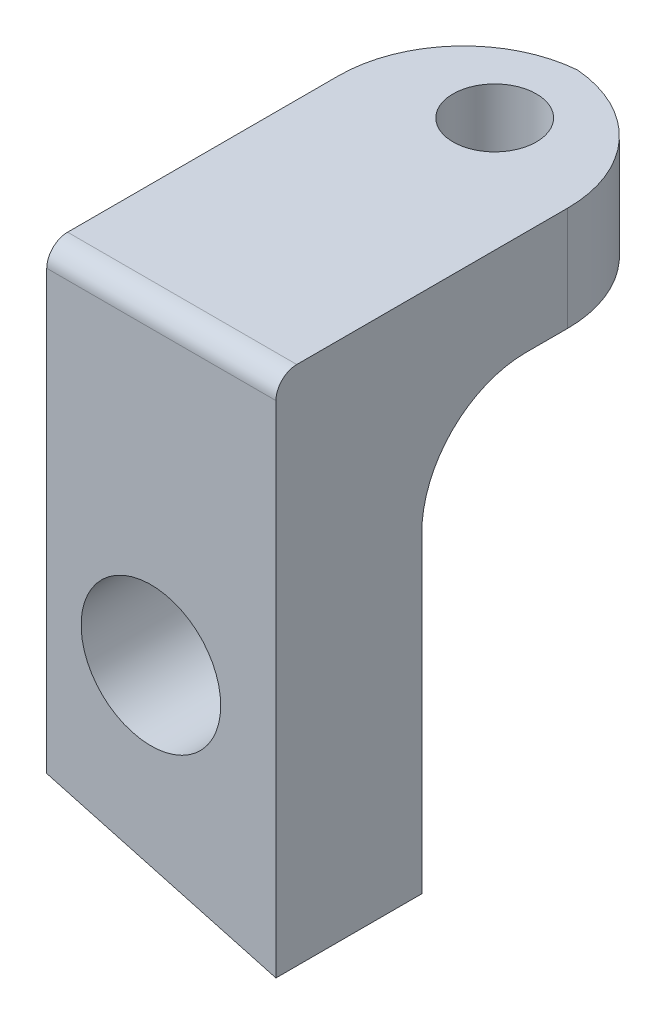
ISO-10303-21;
HEADER;
FILE_DESCRIPTION(('STEP AP214'),'2;1');
FILE_NAME('part.step','',(''),(''),'','','');
FILE_SCHEMA(('AUTOMOTIVE_DESIGN { 1 0 10303 214 1 1 1 1 }'));
ENDSEC;
DATA;
#1=APPLICATION_CONTEXT('core data for automotive mechanical design processes');
#2=APPLICATION_PROTOCOL_DEFINITION('international standard','automotive_design',2000,#1);
#3=PRODUCT_CONTEXT('',#1,'mechanical');
#4=PRODUCT('Part','Part','',(#3));
#5=PRODUCT_RELATED_PRODUCT_CATEGORY('part','',(#4));
#6=PRODUCT_DEFINITION_FORMATION('','',#4);
#7=PRODUCT_DEFINITION_CONTEXT('part definition',#1,'design');
#8=PRODUCT_DEFINITION('design','',#6,#7);
#9=PRODUCT_DEFINITION_SHAPE('','',#8);
#10=(LENGTH_UNIT() NAMED_UNIT(*) SI_UNIT(.MILLI.,.METRE.));
#11=(NAMED_UNIT(*) PLANE_ANGLE_UNIT() SI_UNIT($,.RADIAN.));
#12=(NAMED_UNIT(*) SI_UNIT($,.STERADIAN.) SOLID_ANGLE_UNIT());
#13=UNCERTAINTY_MEASURE_WITH_UNIT(LENGTH_MEASURE(1.E-05),#10,'distance_accuracy_value','');
#14=(GEOMETRIC_REPRESENTATION_CONTEXT(3) GLOBAL_UNCERTAINTY_ASSIGNED_CONTEXT((#13)) GLOBAL_UNIT_ASSIGNED_CONTEXT((#10,
#11,#12)) REPRESENTATION_CONTEXT('',''));
#15=CARTESIAN_POINT('',(0.,0.,0.));
#16=DIRECTION('',(0.,0.,1.));
#17=DIRECTION('',(1.,0.,0.));
#18=AXIS2_PLACEMENT_3D('',#15,#16,#17);
#19=CARTESIAN_POINT('',(0.,0.,7.));
#20=DIRECTION('',(0.,0.,1.));
#21=DIRECTION('',(1.,0.,0.));
#22=AXIS2_PLACEMENT_3D('',#19,#20,#21);
#23=PLANE('',#22);
#24=DIRECTION('',(0.,1.,0.));
#25=VECTOR('',#24,1.);
#26=CARTESIAN_POINT('',(6.,10.,7.));
#27=LINE('',#26,#25);
#28=CARTESIAN_POINT('',(6.,-10.,7.));
#29=VERTEX_POINT('',#28);
#30=CARTESIAN_POINT('',(6.,14.,7.));
#31=VERTEX_POINT('',#30);
#32=EDGE_CURVE('E132',#29,#31,#27,.T.);
#33=ORIENTED_EDGE('',*,*,#32,.T.);
#34=DIRECTION('',(1.,0.,0.));
#35=VECTOR('',#34,1.);
#36=CARTESIAN_POINT('',(-5.,14.,7.));
#37=LINE('',#36,#35);
#38=CARTESIAN_POINT('',(-5.,14.,7.));
#39=VERTEX_POINT('',#38);
#40=EDGE_CURVE('E116',#31,#39,#37,.F.);
#41=ORIENTED_EDGE('',*,*,#40,.T.);
#42=DIRECTION('',(0.,-1.,0.));
#43=VECTOR('',#42,1.);
#44=CARTESIAN_POINT('',(-5.,10.,7.));
#45=LINE('',#44,#43);
#46=CARTESIAN_POINT('',(-5.,-7.,7.));
#47=VERTEX_POINT('',#46);
#48=EDGE_CURVE('E109',#39,#47,#45,.T.);
#49=ORIENTED_EDGE('',*,*,#48,.T.);
#50=DIRECTION('',(0.964763821237732,-0.263117405792109,0.));
#51=VECTOR('',#50,1.);
#52=CARTESIAN_POINT('',(-5.,-7.,7.));
#53=LINE('',#52,#51);
#54=EDGE_CURVE('E113',#47,#29,#53,.T.);
#55=ORIENTED_EDGE('',*,*,#54,.T.);
#56=EDGE_LOOP('',(#33,#41,#49,#55));
#57=FACE_BOUND('',#56,.T.);
#58=CARTESIAN_POINT('',(0.,0.,7.));
#59=DIRECTION('',(0.,0.,1.));
#60=DIRECTION('',(1.,0.,0.));
#61=AXIS2_PLACEMENT_3D('',#58,#59,#60);
#62=CIRCLE('',#61,3.35);
#63=CARTESIAN_POINT('',(3.35,0.,7.));
#64=VERTEX_POINT('',#63);
#65=EDGE_CURVE('E203',#64,#64,#62,.T.);
#66=ORIENTED_EDGE('',*,*,#65,.F.);
#67=EDGE_LOOP('',(#66));
#68=FACE_BOUND('',#67,.T.);
#69=ADVANCED_FACE('F41',(#57,#68),#23,.T.);
#70=CARTESIAN_POINT('',(0.,0.,0.));
#71=DIRECTION('',(0.,0.,1.));
#72=DIRECTION('',(1.,0.,0.));
#73=AXIS2_PLACEMENT_3D('',#70,#71,#72);
#74=PLANE('',#73);
#75=CARTESIAN_POINT('',(0.,0.,0.));
#76=DIRECTION('',(0.,0.,1.));
#77=DIRECTION('',(1.,0.,0.));
#78=AXIS2_PLACEMENT_3D('',#75,#76,#77);
#79=CIRCLE('',#78,4.35);
#80=CARTESIAN_POINT('',(4.35,0.,0.));
#81=VERTEX_POINT('',#80);
#82=EDGE_CURVE('E157',#81,#81,#79,.T.);
#83=ORIENTED_EDGE('',*,*,#82,.T.);
#84=EDGE_LOOP('',(#83));
#85=FACE_BOUND('',#84,.T.);
#86=DIRECTION('',(0.,-1.,0.));
#87=VECTOR('',#86,1.);
#88=CARTESIAN_POINT('',(-5.,10.,0.));
#89=LINE('',#88,#87);
#90=CARTESIAN_POINT('',(-5.,5.,0.));
#91=VERTEX_POINT('',#90);
#92=CARTESIAN_POINT('',(-5.,-7.,0.));
#93=VERTEX_POINT('',#92);
#94=EDGE_CURVE('E136',#91,#93,#89,.T.);
#95=ORIENTED_EDGE('',*,*,#94,.F.);
#96=DIRECTION('',(-1.,0.,0.));
#97=VECTOR('',#96,1.);
#98=CARTESIAN_POINT('',(0.,5.,0.));
#99=LINE('',#98,#97);
#100=CARTESIAN_POINT('',(6.,5.,0.));
#101=VERTEX_POINT('',#100);
#102=EDGE_CURVE('E144',#91,#101,#99,.F.);
#103=ORIENTED_EDGE('',*,*,#102,.T.);
#104=DIRECTION('',(0.,1.,0.));
#105=VECTOR('',#104,1.);
#106=CARTESIAN_POINT('',(6.,10.,0.));
#107=LINE('',#106,#105);
#108=CARTESIAN_POINT('',(6.,-10.,0.));
#109=VERTEX_POINT('',#108);
#110=EDGE_CURVE('E122',#109,#101,#107,.T.);
#111=ORIENTED_EDGE('',*,*,#110,.F.);
#112=DIRECTION('',(0.964763821237732,-0.263117405792109,0.));
#113=VECTOR('',#112,1.);
#114=CARTESIAN_POINT('',(-5.,-7.,0.));
#115=LINE('',#114,#113);
#116=EDGE_CURVE('E222',#93,#109,#115,.T.);
#117=ORIENTED_EDGE('',*,*,#116,.F.);
#118=EDGE_LOOP('',(#95,#103,#111,#117));
#119=FACE_BOUND('',#118,.T.);
#120=ADVANCED_FACE('F269',(#85,#119),#74,.F.);
#121=CARTESIAN_POINT('',(-5.,10.,7.));
#122=DIRECTION('',(1.,0.,0.));
#123=DIRECTION('',(0.,1.,0.));
#124=AXIS2_PLACEMENT_3D('',#121,#122,#123);
#125=PLANE('',#124);
#126=DIRECTION('',(0.,0.,1.));
#127=VECTOR('',#126,1.);
#128=CARTESIAN_POINT('',(-5.,15.,7.));
#129=LINE('',#128,#127);
#130=CARTESIAN_POINT('',(-5.,15.,-7.));
#131=VERTEX_POINT('',#130);
#132=CARTESIAN_POINT('',(-5.,15.,6.));
#133=VERTEX_POINT('',#132);
#134=EDGE_CURVE('E204',#131,#133,#129,.T.);
#135=ORIENTED_EDGE('',*,*,#134,.F.);
#136=DIRECTION('',(0.,-1.,0.));
#137=VECTOR('',#136,1.);
#138=CARTESIAN_POINT('',(-5.,10.,-7.));
#139=LINE('',#138,#137);
#140=CARTESIAN_POINT('',(-5.,10.,-7.));
#141=VERTEX_POINT('',#140);
#142=EDGE_CURVE('E11',#131,#141,#139,.T.);
#143=ORIENTED_EDGE('',*,*,#142,.T.);
#144=DIRECTION('',(0.,0.,1.));
#145=VECTOR('',#144,1.);
#146=CARTESIAN_POINT('',(-5.,10.,7.));
#147=LINE('',#146,#145);
#148=CARTESIAN_POINT('',(-5.,10.,-5.));
#149=VERTEX_POINT('',#148);
#150=EDGE_CURVE('E213',#141,#149,#147,.T.);
#151=ORIENTED_EDGE('',*,*,#150,.T.);
#152=CARTESIAN_POINT('',(-5.,5.,-5.));
#153=DIRECTION('',(1.,0.,0.));
#154=DIRECTION('',(0.,1.,0.));
#155=AXIS2_PLACEMENT_3D('',#152,#153,#154);
#156=CIRCLE('',#155,5.);
#157=EDGE_CURVE('E151',#149,#91,#156,.T.);
#158=ORIENTED_EDGE('',*,*,#157,.T.);
#159=ORIENTED_EDGE('',*,*,#94,.T.);
#160=DIRECTION('',(0.,0.,-1.));
#161=VECTOR('',#160,1.);
#162=CARTESIAN_POINT('',(-5.,-7.,7.));
#163=LINE('',#162,#161);
#164=EDGE_CURVE('E127',#47,#93,#163,.T.);
#165=ORIENTED_EDGE('',*,*,#164,.F.);
#166=ORIENTED_EDGE('',*,*,#48,.F.);
#167=CARTESIAN_POINT('',(-5.,14.,6.));
#168=DIRECTION('',(1.,0.,0.));
#169=DIRECTION('',(0.,1.,0.));
#170=AXIS2_PLACEMENT_3D('',#167,#168,#169);
#171=CIRCLE('',#170,1.);
#172=EDGE_CURVE('E174',#39,#133,#171,.F.);
#173=ORIENTED_EDGE('',*,*,#172,.T.);
#174=EDGE_LOOP('',(#135,#143,#151,#158,#159,#165,#166,#173));
#175=FACE_BOUND('',#174,.T.);
#176=ADVANCED_FACE('F134',(#175),#125,.F.);
#177=CARTESIAN_POINT('',(-5.,-7.,7.));
#178=DIRECTION('',(0.263117405792109,0.964763821237732,0.));
#179=DIRECTION('',(-0.964763821237732,0.263117405792109,0.));
#180=AXIS2_PLACEMENT_3D('',#177,#178,#179);
#181=PLANE('',#180);
#182=ORIENTED_EDGE('',*,*,#116,.T.);
#183=DIRECTION('',(0.,0.,-1.));
#184=VECTOR('',#183,1.);
#185=CARTESIAN_POINT('',(6.,-10.,7.));
#186=LINE('',#185,#184);
#187=EDGE_CURVE('E129',#29,#109,#186,.T.);
#188=ORIENTED_EDGE('',*,*,#187,.F.);
#189=ORIENTED_EDGE('',*,*,#54,.F.);
#190=ORIENTED_EDGE('',*,*,#164,.T.);
#191=EDGE_LOOP('',(#182,#188,#189,#190));
#192=FACE_BOUND('',#191,.T.);
#193=ADVANCED_FACE('F126',(#192),#181,.F.);
#194=CARTESIAN_POINT('',(6.,10.,7.));
#195=DIRECTION('',(-1.,0.,0.));
#196=DIRECTION('',(0.,-1.,0.));
#197=AXIS2_PLACEMENT_3D('',#194,#195,#196);
#198=PLANE('',#197);
#199=DIRECTION('',(0.,0.,-1.));
#200=VECTOR('',#199,1.);
#201=CARTESIAN_POINT('',(6.,10.,7.));
#202=LINE('',#201,#200);
#203=CARTESIAN_POINT('',(6.,10.,-5.));
#204=VERTEX_POINT('',#203);
#205=CARTESIAN_POINT('',(6.,10.,-7.));
#206=VERTEX_POINT('',#205);
#207=EDGE_CURVE('E197',#204,#206,#202,.T.);
#208=ORIENTED_EDGE('',*,*,#207,.T.);
#209=DIRECTION('',(0.,-1.,0.));
#210=VECTOR('',#209,1.);
#211=CARTESIAN_POINT('',(6.,10.,-7.));
#212=LINE('',#211,#210);
#213=CARTESIAN_POINT('',(6.,15.,-7.));
#214=VERTEX_POINT('',#213);
#215=EDGE_CURVE('E183',#206,#214,#212,.F.);
#216=ORIENTED_EDGE('',*,*,#215,.T.);
#217=DIRECTION('',(0.,0.,-1.));
#218=VECTOR('',#217,1.);
#219=CARTESIAN_POINT('',(6.,15.,7.));
#220=LINE('',#219,#218);
#221=CARTESIAN_POINT('',(6.,15.,6.));
#222=VERTEX_POINT('',#221);
#223=EDGE_CURVE('E195',#222,#214,#220,.T.);
#224=ORIENTED_EDGE('',*,*,#223,.F.);
#225=CARTESIAN_POINT('',(6.,14.,6.));
#226=DIRECTION('',(-1.,0.,0.));
#227=DIRECTION('',(0.,-1.,0.));
#228=AXIS2_PLACEMENT_3D('',#225,#226,#227);
#229=CIRCLE('',#228,1.);
#230=EDGE_CURVE('E169',#222,#31,#229,.F.);
#231=ORIENTED_EDGE('',*,*,#230,.T.);
#232=ORIENTED_EDGE('',*,*,#32,.F.);
#233=ORIENTED_EDGE('',*,*,#187,.T.);
#234=ORIENTED_EDGE('',*,*,#110,.T.);
#235=CARTESIAN_POINT('',(6.,5.,-5.));
#236=DIRECTION('',(-1.,0.,0.));
#237=DIRECTION('',(0.,-1.,0.));
#238=AXIS2_PLACEMENT_3D('',#235,#236,#237);
#239=CIRCLE('',#238,5.);
#240=EDGE_CURVE('E154',#101,#204,#239,.T.);
#241=ORIENTED_EDGE('',*,*,#240,.T.);
#242=EDGE_LOOP('',(#208,#216,#224,#231,#232,#233,#234,#241));
#243=FACE_BOUND('',#242,.T.);
#244=ADVANCED_FACE('F194',(#243),#198,.F.);
#245=CARTESIAN_POINT('',(0.,0.,7.));
#246=DIRECTION('',(0.,0.,-1.));
#247=DIRECTION('',(-1.,0.,0.));
#248=AXIS2_PLACEMENT_3D('',#245,#246,#247);
#249=CYLINDRICAL_SURFACE('',#248,3.35);
#250=CARTESIAN_POINT('',(0.,0.,1.));
#251=DIRECTION('',(0.,0.,1.));
#252=DIRECTION('',(1.,0.,0.));
#253=AXIS2_PLACEMENT_3D('',#250,#251,#252);
#254=CIRCLE('',#253,3.35);
#255=CARTESIAN_POINT('',(3.35,0.,1.));
#256=VERTEX_POINT('',#255);
#257=EDGE_CURVE('E161',#256,#256,#254,.F.);
#258=ORIENTED_EDGE('',*,*,#257,.T.);
#259=EDGE_LOOP('',(#258));
#260=FACE_BOUND('',#259,.T.);
#261=ORIENTED_EDGE('',*,*,#65,.T.);
#262=EDGE_LOOP('',(#261));
#263=FACE_BOUND('',#262,.T.);
#264=ADVANCED_FACE('F265',(#260,#263),#249,.F.);
#265=CARTESIAN_POINT('',(0.,15.,0.));
#266=DIRECTION('',(0.,-1.,0.));
#267=DIRECTION('',(0.,0.,-1.));
#268=AXIS2_PLACEMENT_3D('',#265,#266,#267);
#269=PLANE('',#268);
#270=CARTESIAN_POINT('',(0.499999999999999,15.,-9.));
#271=DIRECTION('',(0.,-1.,0.));
#272=DIRECTION('',(0.,0.,-1.));
#273=AXIS2_PLACEMENT_3D('',#270,#271,#272);
#274=CIRCLE('',#273,2.);
#275=CARTESIAN_POINT('',(0.499999999999999,15.,-11.));
#276=VERTEX_POINT('',#275);
#277=EDGE_CURVE('E243',#276,#276,#274,.T.);
#278=ORIENTED_EDGE('',*,*,#277,.T.);
#279=EDGE_LOOP('',(#278));
#280=FACE_BOUND('',#279,.T.);
#281=ORIENTED_EDGE('',*,*,#223,.T.);
#282=CARTESIAN_POINT('',(0.,15.,-7.));
#283=DIRECTION('',(0.,-1.,0.));
#284=DIRECTION('',(0.,0.,-1.));
#285=AXIS2_PLACEMENT_3D('',#282,#283,#284);
#286=CIRCLE('',#285,6.);
#287=CARTESIAN_POINT('',(0.500000000000004,15.,-12.9791303715507));
#288=VERTEX_POINT('',#287);
#289=EDGE_CURVE('E51',#214,#288,#286,.F.);
#290=ORIENTED_EDGE('',*,*,#289,.T.);
#291=CARTESIAN_POINT('',(1.,15.,-7.));
#292=DIRECTION('',(0.,-1.,0.));
#293=DIRECTION('',(0.,0.,-1.));
#294=AXIS2_PLACEMENT_3D('',#291,#292,#293);
#295=CIRCLE('',#294,6.);
#296=EDGE_CURVE('E61',#288,#131,#295,.F.);
#297=ORIENTED_EDGE('',*,*,#296,.T.);
#298=ORIENTED_EDGE('',*,*,#134,.T.);
#299=DIRECTION('',(1.,0.,0.));
#300=VECTOR('',#299,1.);
#301=CARTESIAN_POINT('',(6.,15.,6.));
#302=LINE('',#301,#300);
#303=EDGE_CURVE('E165',#133,#222,#302,.T.);
#304=ORIENTED_EDGE('',*,*,#303,.T.);
#305=EDGE_LOOP('',(#281,#290,#297,#298,#304));
#306=FACE_BOUND('',#305,.T.);
#307=ADVANCED_FACE('F200',(#280,#306),#269,.F.);
#308=CARTESIAN_POINT('',(0.,10.,0.));
#309=DIRECTION('',(0.,-1.,0.));
#310=DIRECTION('',(0.,0.,-1.));
#311=AXIS2_PLACEMENT_3D('',#308,#309,#310);
#312=PLANE('',#311);
#313=CARTESIAN_POINT('',(0.499999999999999,10.,-9.));
#314=DIRECTION('',(0.,-1.,0.));
#315=DIRECTION('',(0.,0.,-1.));
#316=AXIS2_PLACEMENT_3D('',#313,#314,#315);
#317=CIRCLE('',#316,2.);
#318=CARTESIAN_POINT('',(0.499999999999999,10.,-11.));
#319=VERTEX_POINT('',#318);
#320=EDGE_CURVE('E246',#319,#319,#317,.T.);
#321=ORIENTED_EDGE('',*,*,#320,.F.);
#322=EDGE_LOOP('',(#321));
#323=FACE_BOUND('',#322,.T.);
#324=CARTESIAN_POINT('',(1.,10.,-7.));
#325=DIRECTION('',(0.,-1.,0.));
#326=DIRECTION('',(0.,0.,-1.));
#327=AXIS2_PLACEMENT_3D('',#324,#325,#326);
#328=CIRCLE('',#327,6.);
#329=CARTESIAN_POINT('',(0.500000000000004,10.,-12.9791303715507));
#330=VERTEX_POINT('',#329);
#331=EDGE_CURVE('E177',#141,#330,#328,.T.);
#332=ORIENTED_EDGE('',*,*,#331,.T.);
#333=CARTESIAN_POINT('',(0.,10.,-7.));
#334=DIRECTION('',(0.,-1.,0.));
#335=DIRECTION('',(0.,0.,-1.));
#336=AXIS2_PLACEMENT_3D('',#333,#334,#335);
#337=CIRCLE('',#336,6.);
#338=EDGE_CURVE('E180',#330,#206,#337,.T.);
#339=ORIENTED_EDGE('',*,*,#338,.T.);
#340=ORIENTED_EDGE('',*,*,#207,.F.);
#341=DIRECTION('',(-1.,0.,0.));
#342=VECTOR('',#341,1.);
#343=CARTESIAN_POINT('',(0.,10.,-5.));
#344=LINE('',#343,#342);
#345=EDGE_CURVE('E139',#204,#149,#344,.T.);
#346=ORIENTED_EDGE('',*,*,#345,.T.);
#347=ORIENTED_EDGE('',*,*,#150,.F.);
#348=EDGE_LOOP('',(#332,#339,#340,#346,#347));
#349=FACE_BOUND('',#348,.T.);
#350=ADVANCED_FACE('F236',(#323,#349),#312,.T.);
#351=CARTESIAN_POINT('',(0.,5.,-5.));
#352=DIRECTION('',(-1.,0.,0.));
#353=DIRECTION('',(0.,0.,1.));
#354=AXIS2_PLACEMENT_3D('',#351,#352,#353);
#355=CYLINDRICAL_SURFACE('',#354,5.);
#356=ORIENTED_EDGE('',*,*,#240,.F.);
#357=ORIENTED_EDGE('',*,*,#102,.F.);
#358=ORIENTED_EDGE('',*,*,#157,.F.);
#359=ORIENTED_EDGE('',*,*,#345,.F.);
#360=EDGE_LOOP('',(#356,#357,#358,#359));
#361=FACE_BOUND('',#360,.T.);
#362=ADVANCED_FACE('F232',(#361),#355,.F.);
#363=CARTESIAN_POINT('',(0.,0.,1.));
#364=DIRECTION('',(0.,0.,1.));
#365=DIRECTION('',(1.,0.,0.));
#366=AXIS2_PLACEMENT_3D('',#363,#364,#365);
#367=TOROIDAL_SURFACE('',#366,4.35,1.);
#368=ORIENTED_EDGE('',*,*,#257,.F.);
#369=EDGE_LOOP('',(#368));
#370=FACE_BOUND('',#369,.T.);
#371=ORIENTED_EDGE('',*,*,#82,.F.);
#372=EDGE_LOOP('',(#371));
#373=FACE_BOUND('',#372,.T.);
#374=ADVANCED_FACE('F263',(#370,#373),#367,.T.);
#375=CARTESIAN_POINT('',(0.,14.,6.));
#376=DIRECTION('',(-1.,0.,0.));
#377=DIRECTION('',(0.,0.,1.));
#378=AXIS2_PLACEMENT_3D('',#375,#376,#377);
#379=CYLINDRICAL_SURFACE('',#378,1.);
#380=ORIENTED_EDGE('',*,*,#172,.F.);
#381=ORIENTED_EDGE('',*,*,#40,.F.);
#382=ORIENTED_EDGE('',*,*,#230,.F.);
#383=ORIENTED_EDGE('',*,*,#303,.F.);
#384=EDGE_LOOP('',(#380,#381,#382,#383));
#385=FACE_BOUND('',#384,.T.);
#386=ADVANCED_FACE('F285',(#385),#379,.T.);
#387=CARTESIAN_POINT('',(1.,10.,-7.));
#388=DIRECTION('',(0.,-1.,0.));
#389=DIRECTION('',(1.,0.,0.));
#390=AXIS2_PLACEMENT_3D('',#387,#388,#389);
#391=CYLINDRICAL_SURFACE('',#390,6.);
#392=ORIENTED_EDGE('',*,*,#142,.F.);
#393=ORIENTED_EDGE('',*,*,#296,.F.);
#394=DIRECTION('',(0.,-1.,0.));
#395=VECTOR('',#394,1.);
#396=CARTESIAN_POINT('',(0.500000000000004,12.5,-12.9791303715507));
#397=LINE('',#396,#395);
#398=EDGE_CURVE('E45',#330,#288,#397,.F.);
#399=ORIENTED_EDGE('',*,*,#398,.F.);
#400=ORIENTED_EDGE('',*,*,#331,.F.);
#401=EDGE_LOOP('',(#392,#393,#399,#400));
#402=FACE_BOUND('',#401,.T.);
#403=ADVANCED_FACE('F43',(#402),#391,.T.);
#404=CARTESIAN_POINT('',(0.,15.,-7.));
#405=DIRECTION('',(0.,-1.,0.));
#406=DIRECTION('',(1.,0.,0.));
#407=AXIS2_PLACEMENT_3D('',#404,#405,#406);
#408=CYLINDRICAL_SURFACE('',#407,6.);
#409=ORIENTED_EDGE('',*,*,#289,.F.);
#410=ORIENTED_EDGE('',*,*,#215,.F.);
#411=ORIENTED_EDGE('',*,*,#338,.F.);
#412=ORIENTED_EDGE('',*,*,#398,.T.);
#413=EDGE_LOOP('',(#409,#410,#411,#412));
#414=FACE_BOUND('',#413,.T.);
#415=ADVANCED_FACE('F240',(#414),#408,.T.);
#416=CARTESIAN_POINT('',(0.499999999999999,20.,-9.));
#417=DIRECTION('',(0.,-1.,0.));
#418=DIRECTION('',(0.,0.,-1.));
#419=AXIS2_PLACEMENT_3D('',#416,#417,#418);
#420=CYLINDRICAL_SURFACE('',#419,2.);
#421=ORIENTED_EDGE('',*,*,#320,.T.);
#422=EDGE_LOOP('',(#421));
#423=FACE_BOUND('',#422,.T.);
#424=ORIENTED_EDGE('',*,*,#277,.F.);
#425=EDGE_LOOP('',(#424));
#426=FACE_BOUND('',#425,.T.);
#427=ADVANCED_FACE('F254',(#423,#426),#420,.F.);
#428=CLOSED_SHELL('',(#69,#120,#176,#193,#244,#264,#307,#350,#362,#374,#386,#403,#415,#427));
#429=MANIFOLD_SOLID_BREP('B2',#428);
#430=ADVANCED_BREP_SHAPE_REPRESENTATION('',(#18,#429),#14);
#431=SHAPE_DEFINITION_REPRESENTATION(#9,#430);
ENDSEC;
END-ISO-10303-21;
